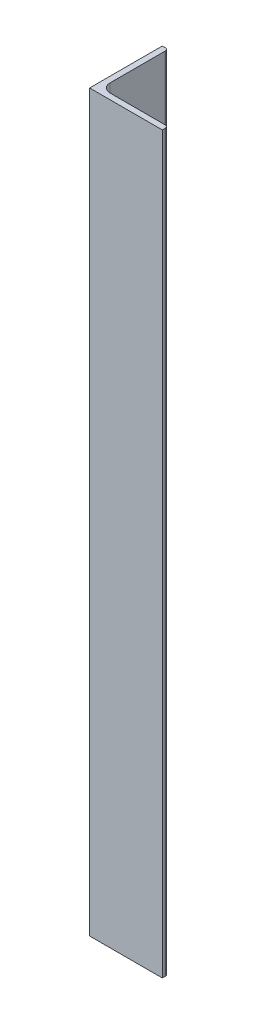
ISO-10303-21;
HEADER;
FILE_DESCRIPTION(('STEP AP214'),'2;1');
FILE_NAME('part.step','',(''),(''),'','','');
FILE_SCHEMA(('AUTOMOTIVE_DESIGN { 1 0 10303 214 1 1 1 1 }'));
ENDSEC;
DATA;
#1=APPLICATION_CONTEXT('core data for automotive mechanical design processes');
#2=APPLICATION_PROTOCOL_DEFINITION('international standard','automotive_design',2000,#1);
#3=PRODUCT_CONTEXT('',#1,'mechanical');
#4=PRODUCT('Part','Part','',(#3));
#5=PRODUCT_RELATED_PRODUCT_CATEGORY('part','',(#4));
#6=PRODUCT_DEFINITION_FORMATION('','',#4);
#7=PRODUCT_DEFINITION_CONTEXT('part definition',#1,'design');
#8=PRODUCT_DEFINITION('design','',#6,#7);
#9=PRODUCT_DEFINITION_SHAPE('','',#8);
#10=(LENGTH_UNIT() NAMED_UNIT(*) SI_UNIT(.MILLI.,.METRE.));
#11=(NAMED_UNIT(*) PLANE_ANGLE_UNIT() SI_UNIT($,.RADIAN.));
#12=(NAMED_UNIT(*) SI_UNIT($,.STERADIAN.) SOLID_ANGLE_UNIT());
#13=UNCERTAINTY_MEASURE_WITH_UNIT(LENGTH_MEASURE(1.E-05),#10,'distance_accuracy_value','');
#14=(GEOMETRIC_REPRESENTATION_CONTEXT(3) GLOBAL_UNCERTAINTY_ASSIGNED_CONTEXT((#13)) GLOBAL_UNIT_ASSIGNED_CONTEXT((#10,
#11,#12)) REPRESENTATION_CONTEXT('',''));
#15=CARTESIAN_POINT('',(0.,0.,0.));
#16=DIRECTION('',(0.,0.,1.));
#17=DIRECTION('',(1.,0.,0.));
#18=AXIS2_PLACEMENT_3D('',#15,#16,#17);
#19=CARTESIAN_POINT('',(0.,758.,0.));
#20=DIRECTION('',(0.,0.,-1.));
#21=DIRECTION('',(-1.,0.,0.));
#22=AXIS2_PLACEMENT_3D('',#19,#20,#21);
#23=PLANE('',#22);
#24=DIRECTION('',(1.,0.,0.));
#25=VECTOR('',#24,1.);
#26=CARTESIAN_POINT('',(0.,0.,0.));
#27=LINE('',#26,#25);
#28=CARTESIAN_POINT('',(0.,0.,0.));
#29=VERTEX_POINT('',#28);
#30=CARTESIAN_POINT('',(75.,0.,0.));
#31=VERTEX_POINT('',#30);
#32=EDGE_CURVE('E145',#29,#31,#27,.T.);
#33=ORIENTED_EDGE('',*,*,#32,.T.);
#34=DIRECTION('',(0.,-1.,0.));
#35=VECTOR('',#34,1.);
#36=CARTESIAN_POINT('',(75.,758.,0.));
#37=LINE('',#36,#35);
#38=CARTESIAN_POINT('',(75.,758.,0.));
#39=VERTEX_POINT('',#38);
#40=EDGE_CURVE('E11',#39,#31,#37,.T.);
#41=ORIENTED_EDGE('',*,*,#40,.F.);
#42=DIRECTION('',(1.,0.,0.));
#43=VECTOR('',#42,1.);
#44=CARTESIAN_POINT('',(0.,758.,0.));
#45=LINE('',#44,#43);
#46=CARTESIAN_POINT('',(0.,758.,0.));
#47=VERTEX_POINT('',#46);
#48=EDGE_CURVE('E161',#47,#39,#45,.T.);
#49=ORIENTED_EDGE('',*,*,#48,.F.);
#50=DIRECTION('',(0.,-1.,0.));
#51=VECTOR('',#50,1.);
#52=CARTESIAN_POINT('',(0.,758.,0.));
#53=LINE('',#52,#51);
#54=EDGE_CURVE('E141',#47,#29,#53,.T.);
#55=ORIENTED_EDGE('',*,*,#54,.T.);
#56=EDGE_LOOP('',(#33,#41,#49,#55));
#57=FACE_BOUND('',#56,.T.);
#58=ADVANCED_FACE('F43',(#57),#23,.F.);
#59=CARTESIAN_POINT('',(75.,758.,0.));
#60=DIRECTION('',(-1.,0.,0.));
#61=DIRECTION('',(0.,0.,1.));
#62=AXIS2_PLACEMENT_3D('',#59,#60,#61);
#63=PLANE('',#62);
#64=DIRECTION('',(0.,0.,-1.));
#65=VECTOR('',#64,1.);
#66=CARTESIAN_POINT('',(75.,0.,0.));
#67=LINE('',#66,#65);
#68=CARTESIAN_POINT('',(75.,0.,-2.99999999999998));
#69=VERTEX_POINT('',#68);
#70=EDGE_CURVE('E148',#31,#69,#67,.T.);
#71=ORIENTED_EDGE('',*,*,#70,.T.);
#72=DIRECTION('',(0.,-1.,0.));
#73=VECTOR('',#72,1.);
#74=CARTESIAN_POINT('',(75.,758.,-2.99999999999998));
#75=LINE('',#74,#73);
#76=CARTESIAN_POINT('',(75.,758.,-2.99999999999998));
#77=VERTEX_POINT('',#76);
#78=EDGE_CURVE('E51',#77,#69,#75,.T.);
#79=ORIENTED_EDGE('',*,*,#78,.F.);
#80=DIRECTION('',(0.,0.,-1.));
#81=VECTOR('',#80,1.);
#82=CARTESIAN_POINT('',(75.,758.,0.));
#83=LINE('',#82,#81);
#84=EDGE_CURVE('E105',#39,#77,#83,.T.);
#85=ORIENTED_EDGE('',*,*,#84,.F.);
#86=ORIENTED_EDGE('',*,*,#40,.T.);
#87=EDGE_LOOP('',(#71,#79,#85,#86));
#88=FACE_BOUND('',#87,.T.);
#89=ADVANCED_FACE('F204',(#88),#63,.F.);
#90=CARTESIAN_POINT('',(72.,758.,-3.));
#91=DIRECTION('',(0.,-1.,0.));
#92=DIRECTION('',(0.,0.,-1.));
#93=AXIS2_PLACEMENT_3D('',#90,#91,#92);
#94=CYLINDRICAL_SURFACE('',#93,3.);
#95=CARTESIAN_POINT('',(72.,0.,-3.));
#96=DIRECTION('',(0.,1.,0.));
#97=DIRECTION('',(0.,0.,1.));
#98=AXIS2_PLACEMENT_3D('',#95,#96,#97);
#99=CIRCLE('',#98,3.);
#100=CARTESIAN_POINT('',(72.,0.,-6.));
#101=VERTEX_POINT('',#100);
#102=EDGE_CURVE('E150',#69,#101,#99,.T.);
#103=ORIENTED_EDGE('',*,*,#102,.T.);
#104=DIRECTION('',(0.,-1.,0.));
#105=VECTOR('',#104,1.);
#106=CARTESIAN_POINT('',(72.,758.,-6.));
#107=LINE('',#106,#105);
#108=CARTESIAN_POINT('',(72.,758.,-6.));
#109=VERTEX_POINT('',#108);
#110=EDGE_CURVE('E171',#109,#101,#107,.T.);
#111=ORIENTED_EDGE('',*,*,#110,.F.);
#112=CARTESIAN_POINT('',(72.,758.,-3.));
#113=DIRECTION('',(0.,1.,0.));
#114=DIRECTION('',(0.,0.,1.));
#115=AXIS2_PLACEMENT_3D('',#112,#113,#114);
#116=CIRCLE('',#115,3.);
#117=EDGE_CURVE('E179',#77,#109,#116,.T.);
#118=ORIENTED_EDGE('',*,*,#117,.F.);
#119=ORIENTED_EDGE('',*,*,#78,.T.);
#120=EDGE_LOOP('',(#103,#111,#118,#119));
#121=FACE_BOUND('',#120,.T.);
#122=ADVANCED_FACE('F177',(#121),#94,.T.);
#123=CARTESIAN_POINT('',(72.,758.,-6.));
#124=DIRECTION('',(0.,0.,1.));
#125=DIRECTION('',(1.,0.,0.));
#126=AXIS2_PLACEMENT_3D('',#123,#124,#125);
#127=PLANE('',#126);
#128=DIRECTION('',(-1.,0.,0.));
#129=VECTOR('',#128,1.);
#130=CARTESIAN_POINT('',(72.,0.,-6.));
#131=LINE('',#130,#129);
#132=CARTESIAN_POINT('',(15.0000000000001,0.,-5.99999999999999));
#133=VERTEX_POINT('',#132);
#134=EDGE_CURVE('E152',#101,#133,#131,.T.);
#135=ORIENTED_EDGE('',*,*,#134,.T.);
#136=DIRECTION('',(0.,-1.,0.));
#137=VECTOR('',#136,1.);
#138=CARTESIAN_POINT('',(15.0000000000001,758.,-5.99999999999999));
#139=LINE('',#138,#137);
#140=CARTESIAN_POINT('',(15.0000000000001,758.,-5.99999999999999));
#141=VERTEX_POINT('',#140);
#142=EDGE_CURVE('E168',#141,#133,#139,.T.);
#143=ORIENTED_EDGE('',*,*,#142,.F.);
#144=DIRECTION('',(-1.,0.,0.));
#145=VECTOR('',#144,1.);
#146=CARTESIAN_POINT('',(72.,758.,-6.));
#147=LINE('',#146,#145);
#148=EDGE_CURVE('E195',#109,#141,#147,.T.);
#149=ORIENTED_EDGE('',*,*,#148,.F.);
#150=ORIENTED_EDGE('',*,*,#110,.T.);
#151=EDGE_LOOP('',(#135,#143,#149,#150));
#152=FACE_BOUND('',#151,.T.);
#153=ADVANCED_FACE('F188',(#152),#127,.F.);
#154=CARTESIAN_POINT('',(15.,758.,-15.));
#155=DIRECTION('',(0.,-1.,0.));
#156=DIRECTION('',(0.,0.,-1.));
#157=AXIS2_PLACEMENT_3D('',#154,#155,#156);
#158=CYLINDRICAL_SURFACE('',#157,9.);
#159=CARTESIAN_POINT('',(15.,0.,-15.));
#160=DIRECTION('',(0.,-1.,0.));
#161=DIRECTION('',(0.,0.,-1.));
#162=AXIS2_PLACEMENT_3D('',#159,#160,#161);
#163=CIRCLE('',#162,9.);
#164=CARTESIAN_POINT('',(6.,0.,-15.0000000000001));
#165=VERTEX_POINT('',#164);
#166=EDGE_CURVE('E154',#133,#165,#163,.T.);
#167=ORIENTED_EDGE('',*,*,#166,.T.);
#168=DIRECTION('',(0.,-1.,0.));
#169=VECTOR('',#168,1.);
#170=CARTESIAN_POINT('',(6.,758.,-15.0000000000001));
#171=LINE('',#170,#169);
#172=CARTESIAN_POINT('',(6.,758.,-15.0000000000001));
#173=VERTEX_POINT('',#172);
#174=EDGE_CURVE('E165',#173,#165,#171,.T.);
#175=ORIENTED_EDGE('',*,*,#174,.F.);
#176=CARTESIAN_POINT('',(15.,758.,-15.));
#177=DIRECTION('',(0.,-1.,0.));
#178=DIRECTION('',(0.,0.,-1.));
#179=AXIS2_PLACEMENT_3D('',#176,#177,#178);
#180=CIRCLE('',#179,9.);
#181=EDGE_CURVE('E194',#141,#173,#180,.T.);
#182=ORIENTED_EDGE('',*,*,#181,.F.);
#183=ORIENTED_EDGE('',*,*,#142,.T.);
#184=EDGE_LOOP('',(#167,#175,#182,#183));
#185=FACE_BOUND('',#184,.T.);
#186=ADVANCED_FACE('F192',(#185),#158,.F.);
#187=CARTESIAN_POINT('',(6.,758.,-15.0000000000001));
#188=DIRECTION('',(-1.,0.,0.));
#189=DIRECTION('',(0.,0.,1.));
#190=AXIS2_PLACEMENT_3D('',#187,#188,#189);
#191=PLANE('',#190);
#192=DIRECTION('',(0.,0.,-1.));
#193=VECTOR('',#192,1.);
#194=CARTESIAN_POINT('',(6.,0.,-15.0000000000001));
#195=LINE('',#194,#193);
#196=CARTESIAN_POINT('',(6.,0.,-72.));
#197=VERTEX_POINT('',#196);
#198=EDGE_CURVE('E156',#165,#197,#195,.T.);
#199=ORIENTED_EDGE('',*,*,#198,.T.);
#200=DIRECTION('',(0.,-1.,0.));
#201=VECTOR('',#200,1.);
#202=CARTESIAN_POINT('',(6.,758.,-72.));
#203=LINE('',#202,#201);
#204=CARTESIAN_POINT('',(6.,758.,-72.));
#205=VERTEX_POINT('',#204);
#206=EDGE_CURVE('E136',#205,#197,#203,.T.);
#207=ORIENTED_EDGE('',*,*,#206,.F.);
#208=DIRECTION('',(0.,0.,-1.));
#209=VECTOR('',#208,1.);
#210=CARTESIAN_POINT('',(6.,758.,-15.0000000000001));
#211=LINE('',#210,#209);
#212=EDGE_CURVE('E127',#173,#205,#211,.T.);
#213=ORIENTED_EDGE('',*,*,#212,.F.);
#214=ORIENTED_EDGE('',*,*,#174,.T.);
#215=EDGE_LOOP('',(#199,#207,#213,#214));
#216=FACE_BOUND('',#215,.T.);
#217=ADVANCED_FACE('F216',(#216),#191,.F.);
#218=CARTESIAN_POINT('',(3.,758.,-72.));
#219=DIRECTION('',(0.,-1.,0.));
#220=DIRECTION('',(0.,0.,-1.));
#221=AXIS2_PLACEMENT_3D('',#218,#219,#220);
#222=CYLINDRICAL_SURFACE('',#221,3.);
#223=CARTESIAN_POINT('',(3.,0.,-72.));
#224=DIRECTION('',(0.,1.,0.));
#225=DIRECTION('',(0.,0.,1.));
#226=AXIS2_PLACEMENT_3D('',#223,#224,#225);
#227=CIRCLE('',#226,3.);
#228=CARTESIAN_POINT('',(2.99999999999998,0.,-75.));
#229=VERTEX_POINT('',#228);
#230=EDGE_CURVE('E135',#197,#229,#227,.T.);
#231=ORIENTED_EDGE('',*,*,#230,.T.);
#232=DIRECTION('',(0.,-1.,0.));
#233=VECTOR('',#232,1.);
#234=CARTESIAN_POINT('',(2.99999999999998,758.,-75.));
#235=LINE('',#234,#233);
#236=CARTESIAN_POINT('',(2.99999999999998,758.,-75.));
#237=VERTEX_POINT('',#236);
#238=EDGE_CURVE('E132',#237,#229,#235,.T.);
#239=ORIENTED_EDGE('',*,*,#238,.F.);
#240=CARTESIAN_POINT('',(3.,758.,-72.));
#241=DIRECTION('',(0.,1.,0.));
#242=DIRECTION('',(0.,0.,1.));
#243=AXIS2_PLACEMENT_3D('',#240,#241,#242);
#244=CIRCLE('',#243,3.);
#245=EDGE_CURVE('E121',#205,#237,#244,.T.);
#246=ORIENTED_EDGE('',*,*,#245,.F.);
#247=ORIENTED_EDGE('',*,*,#206,.T.);
#248=EDGE_LOOP('',(#231,#239,#246,#247));
#249=FACE_BOUND('',#248,.T.);
#250=ADVANCED_FACE('F133',(#249),#222,.T.);
#251=CARTESIAN_POINT('',(2.99999999999998,758.,-75.));
#252=DIRECTION('',(0.,0.,1.));
#253=DIRECTION('',(1.,0.,0.));
#254=AXIS2_PLACEMENT_3D('',#251,#252,#253);
#255=PLANE('',#254);
#256=DIRECTION('',(-1.,0.,0.));
#257=VECTOR('',#256,1.);
#258=CARTESIAN_POINT('',(2.99999999999998,0.,-75.));
#259=LINE('',#258,#257);
#260=CARTESIAN_POINT('',(0.,0.,-75.));
#261=VERTEX_POINT('',#260);
#262=EDGE_CURVE('E91',#229,#261,#259,.T.);
#263=ORIENTED_EDGE('',*,*,#262,.T.);
#264=DIRECTION('',(0.,-1.,0.));
#265=VECTOR('',#264,1.);
#266=CARTESIAN_POINT('',(0.,758.,-75.));
#267=LINE('',#266,#265);
#268=CARTESIAN_POINT('',(0.,758.,-75.));
#269=VERTEX_POINT('',#268);
#270=EDGE_CURVE('E137',#269,#261,#267,.T.);
#271=ORIENTED_EDGE('',*,*,#270,.F.);
#272=DIRECTION('',(-1.,0.,0.));
#273=VECTOR('',#272,1.);
#274=CARTESIAN_POINT('',(2.99999999999998,758.,-75.));
#275=LINE('',#274,#273);
#276=EDGE_CURVE('E125',#237,#269,#275,.T.);
#277=ORIENTED_EDGE('',*,*,#276,.F.);
#278=ORIENTED_EDGE('',*,*,#238,.T.);
#279=EDGE_LOOP('',(#263,#271,#277,#278));
#280=FACE_BOUND('',#279,.T.);
#281=ADVANCED_FACE('F139',(#280),#255,.F.);
#282=CARTESIAN_POINT('',(0.,758.,0.));
#283=DIRECTION('',(1.,0.,0.));
#284=DIRECTION('',(0.,0.,-1.));
#285=AXIS2_PLACEMENT_3D('',#282,#283,#284);
#286=PLANE('',#285);
#287=DIRECTION('',(0.,0.,1.));
#288=VECTOR('',#287,1.);
#289=CARTESIAN_POINT('',(0.,0.,0.));
#290=LINE('',#289,#288);
#291=EDGE_CURVE('E97',#261,#29,#290,.T.);
#292=ORIENTED_EDGE('',*,*,#291,.T.);
#293=ORIENTED_EDGE('',*,*,#54,.F.);
#294=DIRECTION('',(0.,0.,1.));
#295=VECTOR('',#294,1.);
#296=CARTESIAN_POINT('',(0.,758.,0.));
#297=LINE('',#296,#295);
#298=EDGE_CURVE('E59',#269,#47,#297,.T.);
#299=ORIENTED_EDGE('',*,*,#298,.F.);
#300=ORIENTED_EDGE('',*,*,#270,.T.);
#301=EDGE_LOOP('',(#292,#293,#299,#300));
#302=FACE_BOUND('',#301,.T.);
#303=ADVANCED_FACE('F224',(#302),#286,.F.);
#304=CARTESIAN_POINT('',(72.,758.,-3.));
#305=DIRECTION('',(0.,1.,0.));
#306=DIRECTION('',(0.,0.,1.));
#307=AXIS2_PLACEMENT_3D('',#304,#305,#306);
#308=PLANE('',#307);
#309=ORIENTED_EDGE('',*,*,#48,.T.);
#310=ORIENTED_EDGE('',*,*,#84,.T.);
#311=ORIENTED_EDGE('',*,*,#117,.T.);
#312=ORIENTED_EDGE('',*,*,#148,.T.);
#313=ORIENTED_EDGE('',*,*,#181,.T.);
#314=ORIENTED_EDGE('',*,*,#212,.T.);
#315=ORIENTED_EDGE('',*,*,#245,.T.);
#316=ORIENTED_EDGE('',*,*,#276,.T.);
#317=ORIENTED_EDGE('',*,*,#298,.T.);
#318=EDGE_LOOP('',(#309,#310,#311,#312,#313,#314,#315,#316,#317));
#319=FACE_BOUND('',#318,.T.);
#320=ADVANCED_FACE('F123',(#319),#308,.T.);
#321=CARTESIAN_POINT('',(72.,0.,-3.));
#322=DIRECTION('',(0.,1.,0.));
#323=DIRECTION('',(0.,0.,1.));
#324=AXIS2_PLACEMENT_3D('',#321,#322,#323);
#325=PLANE('',#324);
#326=ORIENTED_EDGE('',*,*,#32,.F.);
#327=ORIENTED_EDGE('',*,*,#291,.F.);
#328=ORIENTED_EDGE('',*,*,#262,.F.);
#329=ORIENTED_EDGE('',*,*,#230,.F.);
#330=ORIENTED_EDGE('',*,*,#198,.F.);
#331=ORIENTED_EDGE('',*,*,#166,.F.);
#332=ORIENTED_EDGE('',*,*,#134,.F.);
#333=ORIENTED_EDGE('',*,*,#102,.F.);
#334=ORIENTED_EDGE('',*,*,#70,.F.);
#335=EDGE_LOOP('',(#326,#327,#328,#329,#330,#331,#332,#333,#334));
#336=FACE_BOUND('',#335,.T.);
#337=ADVANCED_FACE('F183',(#336),#325,.F.);
#338=CLOSED_SHELL('',(#58,#89,#122,#153,#186,#217,#250,#281,#303,#320,#337));
#339=MANIFOLD_SOLID_BREP('B2',#338);
#340=ADVANCED_BREP_SHAPE_REPRESENTATION('',(#18,#339),#14);
#341=SHAPE_DEFINITION_REPRESENTATION(#9,#340);
ENDSEC;
END-ISO-10303-21;
